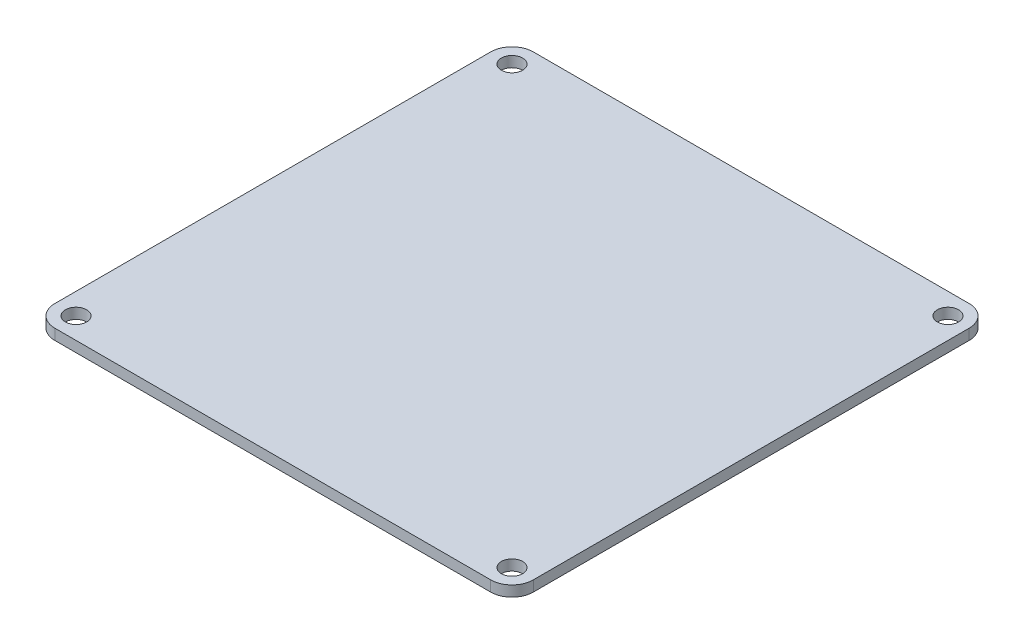
ISO-10303-21;
HEADER;
FILE_DESCRIPTION(('STEP AP214'),'2;1');
FILE_NAME('part.step','',(''),(''),'','','');
FILE_SCHEMA(('AUTOMOTIVE_DESIGN { 1 0 10303 214 1 1 1 1 }'));
ENDSEC;
DATA;
#1=APPLICATION_CONTEXT('core data for automotive mechanical design processes');
#2=APPLICATION_PROTOCOL_DEFINITION('international standard','automotive_design',2000,#1);
#3=PRODUCT_CONTEXT('',#1,'mechanical');
#4=PRODUCT('Part','Part','',(#3));
#5=PRODUCT_RELATED_PRODUCT_CATEGORY('part','',(#4));
#6=PRODUCT_DEFINITION_FORMATION('','',#4);
#7=PRODUCT_DEFINITION_CONTEXT('part definition',#1,'design');
#8=PRODUCT_DEFINITION('design','',#6,#7);
#9=PRODUCT_DEFINITION_SHAPE('','',#8);
#10=(LENGTH_UNIT() NAMED_UNIT(*) SI_UNIT(.MILLI.,.METRE.));
#11=(NAMED_UNIT(*) PLANE_ANGLE_UNIT() SI_UNIT($,.RADIAN.));
#12=(NAMED_UNIT(*) SI_UNIT($,.STERADIAN.) SOLID_ANGLE_UNIT());
#13=UNCERTAINTY_MEASURE_WITH_UNIT(LENGTH_MEASURE(1.E-05),#10,'distance_accuracy_value','');
#14=(GEOMETRIC_REPRESENTATION_CONTEXT(3) GLOBAL_UNCERTAINTY_ASSIGNED_CONTEXT((#13)) GLOBAL_UNIT_ASSIGNED_CONTEXT((#10,
#11,#12)) REPRESENTATION_CONTEXT('',''));
#15=CARTESIAN_POINT('',(0.,0.,0.));
#16=DIRECTION('',(0.,0.,1.));
#17=DIRECTION('',(1.,0.,0.));
#18=AXIS2_PLACEMENT_3D('',#15,#16,#17);
#19=CARTESIAN_POINT('',(2050.,100.,2050.));
#20=DIRECTION('',(0.,-1.,0.));
#21=DIRECTION('',(0.,0.,-1.));
#22=AXIS2_PLACEMENT_3D('',#19,#20,#21);
#23=CYLINDRICAL_SURFACE('',#22,200.);
#24=CARTESIAN_POINT('',(2050.,0.,2050.));
#25=DIRECTION('',(0.,1.,0.));
#26=DIRECTION('',(0.,0.,-1.));
#27=AXIS2_PLACEMENT_3D('',#24,#25,#26);
#28=CIRCLE('',#27,200.);
#29=CARTESIAN_POINT('',(2050.,0.,2250.));
#30=VERTEX_POINT('',#29);
#31=CARTESIAN_POINT('',(2250.,0.,2050.));
#32=VERTEX_POINT('',#31);
#33=EDGE_CURVE('E150',#30,#32,#28,.T.);
#34=ORIENTED_EDGE('',*,*,#33,.T.);
#35=DIRECTION('',(0.,-1.,0.));
#36=VECTOR('',#35,1.);
#37=CARTESIAN_POINT('',(2250.,100.,2050.));
#38=LINE('',#37,#36);
#39=CARTESIAN_POINT('',(2250.,100.,2050.));
#40=VERTEX_POINT('',#39);
#41=EDGE_CURVE('E11',#40,#32,#38,.T.);
#42=ORIENTED_EDGE('',*,*,#41,.F.);
#43=CARTESIAN_POINT('',(2050.,100.,2050.));
#44=DIRECTION('',(0.,1.,0.));
#45=DIRECTION('',(0.,0.,-1.));
#46=AXIS2_PLACEMENT_3D('',#43,#44,#45);
#47=CIRCLE('',#46,200.);
#48=CARTESIAN_POINT('',(2050.,100.,2250.));
#49=VERTEX_POINT('',#48);
#50=EDGE_CURVE('E173',#49,#40,#47,.T.);
#51=ORIENTED_EDGE('',*,*,#50,.F.);
#52=DIRECTION('',(0.,-1.,0.));
#53=VECTOR('',#52,1.);
#54=CARTESIAN_POINT('',(2050.,100.,2250.));
#55=LINE('',#54,#53);
#56=EDGE_CURVE('E146',#49,#30,#55,.T.);
#57=ORIENTED_EDGE('',*,*,#56,.T.);
#58=EDGE_LOOP('',(#34,#42,#51,#57));
#59=FACE_BOUND('',#58,.T.);
#60=ADVANCED_FACE('F47',(#59),#23,.T.);
#61=CARTESIAN_POINT('',(2250.,100.,2050.));
#62=DIRECTION('',(-1.,0.,0.));
#63=DIRECTION('',(0.,0.,1.));
#64=AXIS2_PLACEMENT_3D('',#61,#62,#63);
#65=PLANE('',#64);
#66=DIRECTION('',(0.,0.,-1.));
#67=VECTOR('',#66,1.);
#68=CARTESIAN_POINT('',(2250.,0.,2050.));
#69=LINE('',#68,#67);
#70=CARTESIAN_POINT('',(2250.,0.,-2050.));
#71=VERTEX_POINT('',#70);
#72=EDGE_CURVE('E154',#32,#71,#69,.T.);
#73=ORIENTED_EDGE('',*,*,#72,.T.);
#74=DIRECTION('',(0.,-1.,0.));
#75=VECTOR('',#74,1.);
#76=CARTESIAN_POINT('',(2250.,100.,-2050.));
#77=LINE('',#76,#75);
#78=CARTESIAN_POINT('',(2250.,100.,-2050.));
#79=VERTEX_POINT('',#78);
#80=EDGE_CURVE('E56',#79,#71,#77,.T.);
#81=ORIENTED_EDGE('',*,*,#80,.F.);
#82=DIRECTION('',(0.,0.,-1.));
#83=VECTOR('',#82,1.);
#84=CARTESIAN_POINT('',(2250.,100.,2050.));
#85=LINE('',#84,#83);
#86=EDGE_CURVE('E107',#40,#79,#85,.T.);
#87=ORIENTED_EDGE('',*,*,#86,.F.);
#88=ORIENTED_EDGE('',*,*,#41,.T.);
#89=EDGE_LOOP('',(#73,#81,#87,#88));
#90=FACE_BOUND('',#89,.T.);
#91=ADVANCED_FACE('F280',(#90),#65,.F.);
#92=CARTESIAN_POINT('',(2050.,100.,-2050.));
#93=DIRECTION('',(0.,-1.,0.));
#94=DIRECTION('',(0.,0.,-1.));
#95=AXIS2_PLACEMENT_3D('',#92,#93,#94);
#96=CYLINDRICAL_SURFACE('',#95,200.);
#97=CARTESIAN_POINT('',(2050.,0.,-2050.));
#98=DIRECTION('',(0.,1.,0.));
#99=DIRECTION('',(0.,0.,1.));
#100=AXIS2_PLACEMENT_3D('',#97,#98,#99);
#101=CIRCLE('',#100,200.);
#102=CARTESIAN_POINT('',(2050.,0.,-2250.));
#103=VERTEX_POINT('',#102);
#104=EDGE_CURVE('E158',#71,#103,#101,.T.);
#105=ORIENTED_EDGE('',*,*,#104,.T.);
#106=DIRECTION('',(0.,-1.,0.));
#107=VECTOR('',#106,1.);
#108=CARTESIAN_POINT('',(2050.,100.,-2250.));
#109=LINE('',#108,#107);
#110=CARTESIAN_POINT('',(2050.,100.,-2250.));
#111=VERTEX_POINT('',#110);
#112=EDGE_CURVE('E184',#111,#103,#109,.T.);
#113=ORIENTED_EDGE('',*,*,#112,.F.);
#114=CARTESIAN_POINT('',(2050.,100.,-2050.));
#115=DIRECTION('',(0.,1.,0.));
#116=DIRECTION('',(0.,0.,1.));
#117=AXIS2_PLACEMENT_3D('',#114,#115,#116);
#118=CIRCLE('',#117,200.);
#119=EDGE_CURVE('E196',#79,#111,#118,.T.);
#120=ORIENTED_EDGE('',*,*,#119,.F.);
#121=ORIENTED_EDGE('',*,*,#80,.T.);
#122=EDGE_LOOP('',(#105,#113,#120,#121));
#123=FACE_BOUND('',#122,.T.);
#124=ADVANCED_FACE('F194',(#123),#96,.T.);
#125=CARTESIAN_POINT('',(-2050.,100.,-2250.));
#126=DIRECTION('',(0.,0.,1.));
#127=DIRECTION('',(1.,0.,0.));
#128=AXIS2_PLACEMENT_3D('',#125,#126,#127);
#129=PLANE('',#128);
#130=DIRECTION('',(-1.,0.,0.));
#131=VECTOR('',#130,1.);
#132=CARTESIAN_POINT('',(-2050.,0.,-2250.));
#133=LINE('',#132,#131);
#134=CARTESIAN_POINT('',(-2050.,0.,-2250.));
#135=VERTEX_POINT('',#134);
#136=EDGE_CURVE('E161',#103,#135,#133,.T.);
#137=ORIENTED_EDGE('',*,*,#136,.T.);
#138=DIRECTION('',(0.,-1.,0.));
#139=VECTOR('',#138,1.);
#140=CARTESIAN_POINT('',(-2050.,100.,-2250.));
#141=LINE('',#140,#139);
#142=CARTESIAN_POINT('',(-2050.,100.,-2250.));
#143=VERTEX_POINT('',#142);
#144=EDGE_CURVE('E180',#143,#135,#141,.T.);
#145=ORIENTED_EDGE('',*,*,#144,.F.);
#146=DIRECTION('',(-1.,0.,0.));
#147=VECTOR('',#146,1.);
#148=CARTESIAN_POINT('',(-2050.,100.,-2250.));
#149=LINE('',#148,#147);
#150=EDGE_CURVE('E209',#111,#143,#149,.T.);
#151=ORIENTED_EDGE('',*,*,#150,.F.);
#152=ORIENTED_EDGE('',*,*,#112,.T.);
#153=EDGE_LOOP('',(#137,#145,#151,#152));
#154=FACE_BOUND('',#153,.T.);
#155=ADVANCED_FACE('F204',(#154),#129,.F.);
#156=CARTESIAN_POINT('',(-2050.,100.,-2050.));
#157=DIRECTION('',(0.,-1.,0.));
#158=DIRECTION('',(0.,0.,-1.));
#159=AXIS2_PLACEMENT_3D('',#156,#157,#158);
#160=CYLINDRICAL_SURFACE('',#159,200.);
#161=CARTESIAN_POINT('',(-2050.,0.,-2050.));
#162=DIRECTION('',(0.,1.,0.));
#163=DIRECTION('',(0.,0.,1.));
#164=AXIS2_PLACEMENT_3D('',#161,#162,#163);
#165=CIRCLE('',#164,200.);
#166=CARTESIAN_POINT('',(-2250.,0.,-2050.));
#167=VERTEX_POINT('',#166);
#168=EDGE_CURVE('E164',#135,#167,#165,.T.);
#169=ORIENTED_EDGE('',*,*,#168,.T.);
#170=DIRECTION('',(0.,-1.,0.));
#171=VECTOR('',#170,1.);
#172=CARTESIAN_POINT('',(-2250.,100.,-2050.));
#173=LINE('',#172,#171);
#174=CARTESIAN_POINT('',(-2250.,100.,-2050.));
#175=VERTEX_POINT('',#174);
#176=EDGE_CURVE('E137',#175,#167,#173,.T.);
#177=ORIENTED_EDGE('',*,*,#176,.F.);
#178=CARTESIAN_POINT('',(-2050.,100.,-2050.));
#179=DIRECTION('',(0.,1.,0.));
#180=DIRECTION('',(0.,0.,1.));
#181=AXIS2_PLACEMENT_3D('',#178,#179,#180);
#182=CIRCLE('',#181,200.);
#183=EDGE_CURVE('E126',#143,#175,#182,.T.);
#184=ORIENTED_EDGE('',*,*,#183,.F.);
#185=ORIENTED_EDGE('',*,*,#144,.T.);
#186=EDGE_LOOP('',(#169,#177,#184,#185));
#187=FACE_BOUND('',#186,.T.);
#188=ADVANCED_FACE('F207',(#187),#160,.T.);
#189=CARTESIAN_POINT('',(-2250.,100.,2050.));
#190=DIRECTION('',(1.,0.,0.));
#191=DIRECTION('',(0.,0.,-1.));
#192=AXIS2_PLACEMENT_3D('',#189,#190,#191);
#193=PLANE('',#192);
#194=DIRECTION('',(0.,0.,1.));
#195=VECTOR('',#194,1.);
#196=CARTESIAN_POINT('',(-2250.,0.,2050.));
#197=LINE('',#196,#195);
#198=CARTESIAN_POINT('',(-2250.,0.,2050.));
#199=VERTEX_POINT('',#198);
#200=EDGE_CURVE('E135',#167,#199,#197,.T.);
#201=ORIENTED_EDGE('',*,*,#200,.T.);
#202=DIRECTION('',(0.,-1.,0.));
#203=VECTOR('',#202,1.);
#204=CARTESIAN_POINT('',(-2250.,100.,2050.));
#205=LINE('',#204,#203);
#206=CARTESIAN_POINT('',(-2250.,100.,2050.));
#207=VERTEX_POINT('',#206);
#208=EDGE_CURVE('E132',#207,#199,#205,.T.);
#209=ORIENTED_EDGE('',*,*,#208,.F.);
#210=DIRECTION('',(0.,0.,1.));
#211=VECTOR('',#210,1.);
#212=CARTESIAN_POINT('',(-2250.,100.,2050.));
#213=LINE('',#212,#211);
#214=EDGE_CURVE('E120',#175,#207,#213,.T.);
#215=ORIENTED_EDGE('',*,*,#214,.F.);
#216=ORIENTED_EDGE('',*,*,#176,.T.);
#217=EDGE_LOOP('',(#201,#209,#215,#216));
#218=FACE_BOUND('',#217,.T.);
#219=ADVANCED_FACE('F133',(#218),#193,.F.);
#220=CARTESIAN_POINT('',(-2050.,100.,2050.));
#221=DIRECTION('',(0.,-1.,0.));
#222=DIRECTION('',(0.,0.,-1.));
#223=AXIS2_PLACEMENT_3D('',#220,#221,#222);
#224=CYLINDRICAL_SURFACE('',#223,200.);
#225=CARTESIAN_POINT('',(-2050.,0.,2050.));
#226=DIRECTION('',(0.,1.,0.));
#227=DIRECTION('',(0.,0.,-1.));
#228=AXIS2_PLACEMENT_3D('',#225,#226,#227);
#229=CIRCLE('',#228,200.);
#230=CARTESIAN_POINT('',(-2050.,0.,2250.));
#231=VERTEX_POINT('',#230);
#232=EDGE_CURVE('E93',#199,#231,#229,.T.);
#233=ORIENTED_EDGE('',*,*,#232,.T.);
#234=DIRECTION('',(0.,-1.,0.));
#235=VECTOR('',#234,1.);
#236=CARTESIAN_POINT('',(-2050.,100.,2250.));
#237=LINE('',#236,#235);
#238=CARTESIAN_POINT('',(-2050.,100.,2250.));
#239=VERTEX_POINT('',#238);
#240=EDGE_CURVE('E138',#239,#231,#237,.T.);
#241=ORIENTED_EDGE('',*,*,#240,.F.);
#242=CARTESIAN_POINT('',(-2050.,100.,2050.));
#243=DIRECTION('',(0.,1.,0.));
#244=DIRECTION('',(0.,0.,-1.));
#245=AXIS2_PLACEMENT_3D('',#242,#243,#244);
#246=CIRCLE('',#245,200.);
#247=EDGE_CURVE('E124',#207,#239,#246,.T.);
#248=ORIENTED_EDGE('',*,*,#247,.F.);
#249=ORIENTED_EDGE('',*,*,#208,.T.);
#250=EDGE_LOOP('',(#233,#241,#248,#249));
#251=FACE_BOUND('',#250,.T.);
#252=ADVANCED_FACE('F140',(#251),#224,.T.);
#253=CARTESIAN_POINT('',(-2050.,100.,2250.));
#254=DIRECTION('',(0.,0.,-1.));
#255=DIRECTION('',(-1.,0.,0.));
#256=AXIS2_PLACEMENT_3D('',#253,#254,#255);
#257=PLANE('',#256);
#258=DIRECTION('',(1.,0.,0.));
#259=VECTOR('',#258,1.);
#260=CARTESIAN_POINT('',(-2050.,0.,2250.));
#261=LINE('',#260,#259);
#262=EDGE_CURVE('E99',#231,#30,#261,.T.);
#263=ORIENTED_EDGE('',*,*,#262,.T.);
#264=ORIENTED_EDGE('',*,*,#56,.F.);
#265=DIRECTION('',(1.,0.,0.));
#266=VECTOR('',#265,1.);
#267=CARTESIAN_POINT('',(-2050.,100.,2250.));
#268=LINE('',#267,#266);
#269=EDGE_CURVE('E64',#239,#49,#268,.T.);
#270=ORIENTED_EDGE('',*,*,#269,.F.);
#271=ORIENTED_EDGE('',*,*,#240,.T.);
#272=EDGE_LOOP('',(#263,#264,#270,#271));
#273=FACE_BOUND('',#272,.T.);
#274=ADVANCED_FACE('F259',(#273),#257,.F.);
#275=CARTESIAN_POINT('',(2050.,100.,2050.));
#276=DIRECTION('',(0.,-1.,0.));
#277=DIRECTION('',(0.,0.,-1.));
#278=AXIS2_PLACEMENT_3D('',#275,#276,#277);
#279=PLANE('',#278);
#280=CARTESIAN_POINT('',(2050.,100.,-2050.));
#281=DIRECTION('',(0.,1.,0.));
#282=DIRECTION('',(0.,0.,-1.));
#283=AXIS2_PLACEMENT_3D('',#280,#281,#282);
#284=CIRCLE('',#283,100.);
#285=CARTESIAN_POINT('',(2050.,100.,-2150.));
#286=VERTEX_POINT('',#285);
#287=EDGE_CURVE('E233',#286,#286,#284,.T.);
#288=ORIENTED_EDGE('',*,*,#287,.F.);
#289=EDGE_LOOP('',(#288));
#290=FACE_BOUND('',#289,.T.);
#291=CARTESIAN_POINT('',(2050.,100.,2050.));
#292=DIRECTION('',(0.,1.,0.));
#293=DIRECTION('',(0.,0.,1.));
#294=AXIS2_PLACEMENT_3D('',#291,#292,#293);
#295=CIRCLE('',#294,100.);
#296=CARTESIAN_POINT('',(2050.,100.,2150.));
#297=VERTEX_POINT('',#296);
#298=EDGE_CURVE('E241',#297,#297,#295,.T.);
#299=ORIENTED_EDGE('',*,*,#298,.F.);
#300=EDGE_LOOP('',(#299));
#301=FACE_BOUND('',#300,.T.);
#302=CARTESIAN_POINT('',(-2050.,100.,2050.));
#303=DIRECTION('',(0.,1.,0.));
#304=DIRECTION('',(0.,0.,-1.));
#305=AXIS2_PLACEMENT_3D('',#302,#303,#304);
#306=CIRCLE('',#305,100.);
#307=CARTESIAN_POINT('',(-2050.,100.,1950.));
#308=VERTEX_POINT('',#307);
#309=EDGE_CURVE('E225',#308,#308,#306,.T.);
#310=ORIENTED_EDGE('',*,*,#309,.F.);
#311=EDGE_LOOP('',(#310));
#312=FACE_BOUND('',#311,.T.);
#313=CARTESIAN_POINT('',(-2050.,100.,-2050.));
#314=DIRECTION('',(0.,1.,0.));
#315=DIRECTION('',(0.,0.,1.));
#316=AXIS2_PLACEMENT_3D('',#313,#314,#315);
#317=CIRCLE('',#316,100.);
#318=CARTESIAN_POINT('',(-2050.,100.,-1950.));
#319=VERTEX_POINT('',#318);
#320=EDGE_CURVE('E221',#319,#319,#317,.T.);
#321=ORIENTED_EDGE('',*,*,#320,.F.);
#322=EDGE_LOOP('',(#321));
#323=FACE_BOUND('',#322,.T.);
#324=ORIENTED_EDGE('',*,*,#50,.T.);
#325=ORIENTED_EDGE('',*,*,#86,.T.);
#326=ORIENTED_EDGE('',*,*,#119,.T.);
#327=ORIENTED_EDGE('',*,*,#150,.T.);
#328=ORIENTED_EDGE('',*,*,#183,.T.);
#329=ORIENTED_EDGE('',*,*,#214,.T.);
#330=ORIENTED_EDGE('',*,*,#247,.T.);
#331=ORIENTED_EDGE('',*,*,#269,.T.);
#332=EDGE_LOOP('',(#324,#325,#326,#327,#328,#329,#330,#331));
#333=FACE_BOUND('',#332,.T.);
#334=ADVANCED_FACE('F122',(#290,#301,#312,#323,#333),#279,.F.);
#335=CARTESIAN_POINT('',(2050.,0.,2050.));
#336=DIRECTION('',(0.,-1.,0.));
#337=DIRECTION('',(0.,0.,-1.));
#338=AXIS2_PLACEMENT_3D('',#335,#336,#337);
#339=PLANE('',#338);
#340=CARTESIAN_POINT('',(2050.,0.,-2050.));
#341=DIRECTION('',(0.,1.,0.));
#342=DIRECTION('',(0.,0.,-1.));
#343=AXIS2_PLACEMENT_3D('',#340,#341,#342);
#344=CIRCLE('',#343,100.);
#345=CARTESIAN_POINT('',(2050.,0.,-2150.));
#346=VERTEX_POINT('',#345);
#347=EDGE_CURVE('E229',#346,#346,#344,.T.);
#348=ORIENTED_EDGE('',*,*,#347,.T.);
#349=EDGE_LOOP('',(#348));
#350=FACE_BOUND('',#349,.T.);
#351=CARTESIAN_POINT('',(2050.,0.,2050.));
#352=DIRECTION('',(0.,1.,0.));
#353=DIRECTION('',(0.,0.,1.));
#354=AXIS2_PLACEMENT_3D('',#351,#352,#353);
#355=CIRCLE('',#354,100.);
#356=CARTESIAN_POINT('',(2050.,0.,2150.));
#357=VERTEX_POINT('',#356);
#358=EDGE_CURVE('E237',#357,#357,#355,.T.);
#359=ORIENTED_EDGE('',*,*,#358,.T.);
#360=EDGE_LOOP('',(#359));
#361=FACE_BOUND('',#360,.T.);
#362=CARTESIAN_POINT('',(-2050.,0.,2050.));
#363=DIRECTION('',(0.,1.,0.));
#364=DIRECTION('',(0.,0.,-1.));
#365=AXIS2_PLACEMENT_3D('',#362,#363,#364);
#366=CIRCLE('',#365,100.);
#367=CARTESIAN_POINT('',(-2050.,0.,1950.));
#368=VERTEX_POINT('',#367);
#369=EDGE_CURVE('E245',#368,#368,#366,.T.);
#370=ORIENTED_EDGE('',*,*,#369,.T.);
#371=EDGE_LOOP('',(#370));
#372=FACE_BOUND('',#371,.T.);
#373=CARTESIAN_POINT('',(-2050.,0.,-2050.));
#374=DIRECTION('',(0.,1.,0.));
#375=DIRECTION('',(0.,0.,1.));
#376=AXIS2_PLACEMENT_3D('',#373,#374,#375);
#377=CIRCLE('',#376,100.);
#378=CARTESIAN_POINT('',(-2050.,0.,-1950.));
#379=VERTEX_POINT('',#378);
#380=EDGE_CURVE('E155',#379,#379,#377,.T.);
#381=ORIENTED_EDGE('',*,*,#380,.T.);
#382=EDGE_LOOP('',(#381));
#383=FACE_BOUND('',#382,.T.);
#384=ORIENTED_EDGE('',*,*,#33,.F.);
#385=ORIENTED_EDGE('',*,*,#262,.F.);
#386=ORIENTED_EDGE('',*,*,#232,.F.);
#387=ORIENTED_EDGE('',*,*,#200,.F.);
#388=ORIENTED_EDGE('',*,*,#168,.F.);
#389=ORIENTED_EDGE('',*,*,#136,.F.);
#390=ORIENTED_EDGE('',*,*,#104,.F.);
#391=ORIENTED_EDGE('',*,*,#72,.F.);
#392=EDGE_LOOP('',(#384,#385,#386,#387,#388,#389,#390,#391));
#393=FACE_BOUND('',#392,.T.);
#394=ADVANCED_FACE('F200',(#350,#361,#372,#383,#393),#339,.T.);
#395=CARTESIAN_POINT('',(-2050.,0.,-2050.));
#396=DIRECTION('',(0.,1.,0.));
#397=DIRECTION('',(0.,0.,1.));
#398=AXIS2_PLACEMENT_3D('',#395,#396,#397);
#399=CYLINDRICAL_SURFACE('',#398,100.);
#400=ORIENTED_EDGE('',*,*,#380,.F.);
#401=EDGE_LOOP('',(#400));
#402=FACE_BOUND('',#401,.T.);
#403=ORIENTED_EDGE('',*,*,#320,.T.);
#404=EDGE_LOOP('',(#403));
#405=FACE_BOUND('',#404,.T.);
#406=ADVANCED_FACE('F264',(#402,#405),#399,.F.);
#407=CARTESIAN_POINT('',(-2050.,0.,2050.));
#408=DIRECTION('',(0.,1.,0.));
#409=DIRECTION('',(0.,0.,1.));
#410=AXIS2_PLACEMENT_3D('',#407,#408,#409);
#411=CYLINDRICAL_SURFACE('',#410,100.);
#412=ORIENTED_EDGE('',*,*,#369,.F.);
#413=EDGE_LOOP('',(#412));
#414=FACE_BOUND('',#413,.T.);
#415=ORIENTED_EDGE('',*,*,#309,.T.);
#416=EDGE_LOOP('',(#415));
#417=FACE_BOUND('',#416,.T.);
#418=ADVANCED_FACE('F255',(#414,#417),#411,.F.);
#419=CARTESIAN_POINT('',(2050.,0.,2050.));
#420=DIRECTION('',(0.,1.,0.));
#421=DIRECTION('',(0.,0.,1.));
#422=AXIS2_PLACEMENT_3D('',#419,#420,#421);
#423=CYLINDRICAL_SURFACE('',#422,100.);
#424=ORIENTED_EDGE('',*,*,#358,.F.);
#425=EDGE_LOOP('',(#424));
#426=FACE_BOUND('',#425,.T.);
#427=ORIENTED_EDGE('',*,*,#298,.T.);
#428=EDGE_LOOP('',(#427));
#429=FACE_BOUND('',#428,.T.);
#430=ADVANCED_FACE('F272',(#426,#429),#423,.F.);
#431=CARTESIAN_POINT('',(2050.,0.,-2050.));
#432=DIRECTION('',(0.,1.,0.));
#433=DIRECTION('',(0.,0.,1.));
#434=AXIS2_PLACEMENT_3D('',#431,#432,#433);
#435=CYLINDRICAL_SURFACE('',#434,100.);
#436=ORIENTED_EDGE('',*,*,#347,.F.);
#437=EDGE_LOOP('',(#436));
#438=FACE_BOUND('',#437,.T.);
#439=ORIENTED_EDGE('',*,*,#287,.T.);
#440=EDGE_LOOP('',(#439));
#441=FACE_BOUND('',#440,.T.);
#442=ADVANCED_FACE('F361',(#438,#441),#435,.F.);
#443=CLOSED_SHELL('',(#60,#91,#124,#155,#188,#219,#252,#274,#334,#394,#406,#418,#430,#442));
#444=MANIFOLD_SOLID_BREP('B2',#443);
#445=ADVANCED_BREP_SHAPE_REPRESENTATION('',(#18,#444),#14);
#446=SHAPE_DEFINITION_REPRESENTATION(#9,#445);
ENDSEC;
END-ISO-10303-21;
